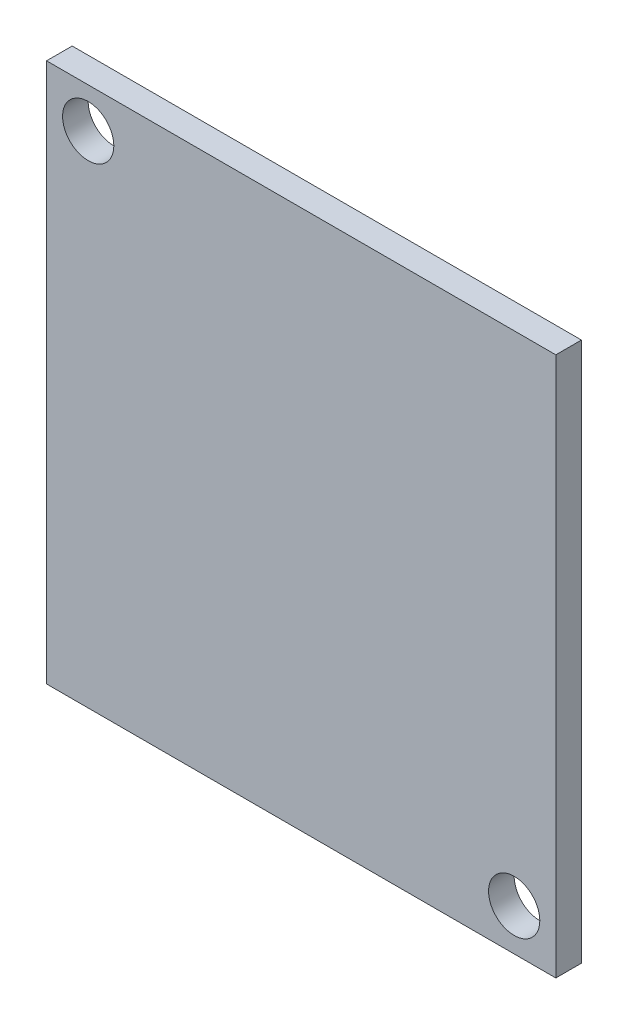
ISO-10303-21;
HEADER;
FILE_DESCRIPTION(('STEP AP214'),'2;1');
FILE_NAME('part.step','',(''),(''),'','','');
FILE_SCHEMA(('AUTOMOTIVE_DESIGN { 1 0 10303 214 1 1 1 1 }'));
ENDSEC;
DATA;
#1=APPLICATION_CONTEXT('core data for automotive mechanical design processes');
#2=APPLICATION_PROTOCOL_DEFINITION('international standard','automotive_design',2000,#1);
#3=PRODUCT_CONTEXT('',#1,'mechanical');
#4=PRODUCT('Part','Part','',(#3));
#5=PRODUCT_RELATED_PRODUCT_CATEGORY('part','',(#4));
#6=PRODUCT_DEFINITION_FORMATION('','',#4);
#7=PRODUCT_DEFINITION_CONTEXT('part definition',#1,'design');
#8=PRODUCT_DEFINITION('design','',#6,#7);
#9=PRODUCT_DEFINITION_SHAPE('','',#8);
#10=(LENGTH_UNIT() NAMED_UNIT(*) SI_UNIT(.MILLI.,.METRE.));
#11=(NAMED_UNIT(*) PLANE_ANGLE_UNIT() SI_UNIT($,.RADIAN.));
#12=(NAMED_UNIT(*) SI_UNIT($,.STERADIAN.) SOLID_ANGLE_UNIT());
#13=UNCERTAINTY_MEASURE_WITH_UNIT(LENGTH_MEASURE(1.E-05),#10,'distance_accuracy_value','');
#14=(GEOMETRIC_REPRESENTATION_CONTEXT(3) GLOBAL_UNCERTAINTY_ASSIGNED_CONTEXT((#13)) GLOBAL_UNIT_ASSIGNED_CONTEXT((#10,
#11,#12)) REPRESENTATION_CONTEXT('',''));
#15=CARTESIAN_POINT('',(0.,0.,0.));
#16=DIRECTION('',(0.,0.,1.));
#17=DIRECTION('',(1.,0.,0.));
#18=AXIS2_PLACEMENT_3D('',#15,#16,#17);
#19=CARTESIAN_POINT('',(0.,0.,0.));
#20=DIRECTION('',(0.,0.,1.));
#21=DIRECTION('',(1.,0.,0.));
#22=AXIS2_PLACEMENT_3D('',#19,#20,#21);
#23=PLANE('',#22);
#24=CARTESIAN_POINT('',(13.3,-14.25,0.));
#25=DIRECTION('',(0.,0.,1.));
#26=DIRECTION('',(1.,0.,0.));
#27=AXIS2_PLACEMENT_3D('',#24,#25,#26);
#28=CIRCLE('',#27,1.6);
#29=CARTESIAN_POINT('',(14.9,-14.25,0.));
#30=VERTEX_POINT('',#29);
#31=EDGE_CURVE('E88',#30,#30,#28,.T.);
#32=ORIENTED_EDGE('',*,*,#31,.T.);
#33=EDGE_LOOP('',(#32));
#34=FACE_BOUND('',#33,.T.);
#35=CARTESIAN_POINT('',(-13.3,14.35,0.));
#36=DIRECTION('',(0.,0.,1.));
#37=DIRECTION('',(1.,0.,0.));
#38=AXIS2_PLACEMENT_3D('',#35,#36,#37);
#39=CIRCLE('',#38,1.6);
#40=CARTESIAN_POINT('',(-11.7,14.35,0.));
#41=VERTEX_POINT('',#40);
#42=EDGE_CURVE('E20',#41,#41,#39,.T.);
#43=ORIENTED_EDGE('',*,*,#42,.T.);
#44=EDGE_LOOP('',(#43));
#45=FACE_BOUND('',#44,.T.);
#46=DIRECTION('',(0.,1.,0.));
#47=VECTOR('',#46,1.);
#48=CARTESIAN_POINT('',(-15.9,-16.85,0.));
#49=LINE('',#48,#47);
#50=CARTESIAN_POINT('',(-15.9,16.85,0.));
#51=VERTEX_POINT('',#50);
#52=CARTESIAN_POINT('',(-15.9,-16.85,0.));
#53=VERTEX_POINT('',#52);
#54=EDGE_CURVE('E64',#51,#53,#49,.F.);
#55=ORIENTED_EDGE('',*,*,#54,.F.);
#56=DIRECTION('',(1.,0.,0.));
#57=VECTOR('',#56,1.);
#58=CARTESIAN_POINT('',(-15.9,16.85,0.));
#59=LINE('',#58,#57);
#60=CARTESIAN_POINT('',(15.9,16.85,0.));
#61=VERTEX_POINT('',#60);
#62=EDGE_CURVE('E99',#61,#51,#59,.F.);
#63=ORIENTED_EDGE('',*,*,#62,.F.);
#64=DIRECTION('',(0.,1.,0.));
#65=VECTOR('',#64,1.);
#66=CARTESIAN_POINT('',(15.9,16.85,0.));
#67=LINE('',#66,#65);
#68=CARTESIAN_POINT('',(15.9,-16.85,0.));
#69=VERTEX_POINT('',#68);
#70=EDGE_CURVE('E74',#69,#61,#67,.T.);
#71=ORIENTED_EDGE('',*,*,#70,.F.);
#72=DIRECTION('',(1.,0.,0.));
#73=VECTOR('',#72,1.);
#74=CARTESIAN_POINT('',(15.9,-16.85,0.));
#75=LINE('',#74,#73);
#76=EDGE_CURVE('E59',#53,#69,#75,.T.);
#77=ORIENTED_EDGE('',*,*,#76,.F.);
#78=EDGE_LOOP('',(#55,#63,#71,#77));
#79=FACE_BOUND('',#78,.T.);
#80=ADVANCED_FACE('F17',(#34,#45,#79),#23,.F.);
#81=CARTESIAN_POINT('',(-15.9,-16.85,0.));
#82=DIRECTION('',(-1.,0.,0.));
#83=DIRECTION('',(0.,0.,1.));
#84=AXIS2_PLACEMENT_3D('',#81,#82,#83);
#85=PLANE('',#84);
#86=ORIENTED_EDGE('',*,*,#54,.T.);
#87=DIRECTION('',(0.,0.,-1.));
#88=VECTOR('',#87,1.);
#89=CARTESIAN_POINT('',(-15.9,-16.85,0.));
#90=LINE('',#89,#88);
#91=CARTESIAN_POINT('',(-15.9,-16.85,1.6));
#92=VERTEX_POINT('',#91);
#93=EDGE_CURVE('E66',#92,#53,#90,.T.);
#94=ORIENTED_EDGE('',*,*,#93,.F.);
#95=DIRECTION('',(0.,1.,0.));
#96=VECTOR('',#95,1.);
#97=CARTESIAN_POINT('',(-15.9,0.,1.6));
#98=LINE('',#97,#96);
#99=CARTESIAN_POINT('',(-15.9,16.85,1.6));
#100=VERTEX_POINT('',#99);
#101=EDGE_CURVE('E91',#100,#92,#98,.F.);
#102=ORIENTED_EDGE('',*,*,#101,.F.);
#103=DIRECTION('',(0.,0.,1.));
#104=VECTOR('',#103,1.);
#105=CARTESIAN_POINT('',(-15.9,16.85,0.));
#106=LINE('',#105,#104);
#107=EDGE_CURVE('E69',#51,#100,#106,.T.);
#108=ORIENTED_EDGE('',*,*,#107,.F.);
#109=EDGE_LOOP('',(#86,#94,#102,#108));
#110=FACE_BOUND('',#109,.T.);
#111=ADVANCED_FACE('F65',(#110),#85,.T.);
#112=CARTESIAN_POINT('',(15.9,-16.85,0.));
#113=DIRECTION('',(0.,-1.,0.));
#114=DIRECTION('',(0.,0.,-1.));
#115=AXIS2_PLACEMENT_3D('',#112,#113,#114);
#116=PLANE('',#115);
#117=ORIENTED_EDGE('',*,*,#76,.T.);
#118=DIRECTION('',(0.,0.,-1.));
#119=VECTOR('',#118,1.);
#120=CARTESIAN_POINT('',(15.9,-16.85,0.));
#121=LINE('',#120,#119);
#122=CARTESIAN_POINT('',(15.9,-16.85,1.6));
#123=VERTEX_POINT('',#122);
#124=EDGE_CURVE('E77',#123,#69,#121,.T.);
#125=ORIENTED_EDGE('',*,*,#124,.F.);
#126=DIRECTION('',(1.,0.,0.));
#127=VECTOR('',#126,1.);
#128=CARTESIAN_POINT('',(0.,-16.85,1.6));
#129=LINE('',#128,#127);
#130=EDGE_CURVE('E81',#92,#123,#129,.T.);
#131=ORIENTED_EDGE('',*,*,#130,.F.);
#132=ORIENTED_EDGE('',*,*,#93,.T.);
#133=EDGE_LOOP('',(#117,#125,#131,#132));
#134=FACE_BOUND('',#133,.T.);
#135=ADVANCED_FACE('F79',(#134),#116,.T.);
#136=CARTESIAN_POINT('',(15.9,16.85,0.));
#137=DIRECTION('',(1.,0.,0.));
#138=DIRECTION('',(0.,0.,-1.));
#139=AXIS2_PLACEMENT_3D('',#136,#137,#138);
#140=PLANE('',#139);
#141=ORIENTED_EDGE('',*,*,#70,.T.);
#142=DIRECTION('',(0.,0.,1.));
#143=VECTOR('',#142,1.);
#144=CARTESIAN_POINT('',(15.9,16.85,0.));
#145=LINE('',#144,#143);
#146=CARTESIAN_POINT('',(15.9,16.85,1.6));
#147=VERTEX_POINT('',#146);
#148=EDGE_CURVE('E39',#147,#61,#145,.F.);
#149=ORIENTED_EDGE('',*,*,#148,.F.);
#150=DIRECTION('',(0.,1.,0.));
#151=VECTOR('',#150,1.);
#152=CARTESIAN_POINT('',(15.9,0.,1.6));
#153=LINE('',#152,#151);
#154=EDGE_CURVE('E112',#123,#147,#153,.T.);
#155=ORIENTED_EDGE('',*,*,#154,.F.);
#156=ORIENTED_EDGE('',*,*,#124,.T.);
#157=EDGE_LOOP('',(#141,#149,#155,#156));
#158=FACE_BOUND('',#157,.T.);
#159=ADVANCED_FACE('F110',(#158),#140,.T.);
#160=CARTESIAN_POINT('',(-15.9,16.85,0.));
#161=DIRECTION('',(0.,1.,0.));
#162=DIRECTION('',(0.,0.,1.));
#163=AXIS2_PLACEMENT_3D('',#160,#161,#162);
#164=PLANE('',#163);
#165=ORIENTED_EDGE('',*,*,#62,.T.);
#166=ORIENTED_EDGE('',*,*,#107,.T.);
#167=DIRECTION('',(1.,0.,0.));
#168=VECTOR('',#167,1.);
#169=CARTESIAN_POINT('',(0.,16.85,1.6));
#170=LINE('',#169,#168);
#171=EDGE_CURVE('E87',#147,#100,#170,.F.);
#172=ORIENTED_EDGE('',*,*,#171,.F.);
#173=ORIENTED_EDGE('',*,*,#148,.T.);
#174=EDGE_LOOP('',(#165,#166,#172,#173));
#175=FACE_BOUND('',#174,.T.);
#176=ADVANCED_FACE('F120',(#175),#164,.T.);
#177=CARTESIAN_POINT('',(-13.3,14.35,-2.4));
#178=DIRECTION('',(0.,0.,1.));
#179=DIRECTION('',(1.,0.,0.));
#180=AXIS2_PLACEMENT_3D('',#177,#178,#179);
#181=CYLINDRICAL_SURFACE('',#180,1.6);
#182=CARTESIAN_POINT('',(-13.3,14.35,1.6));
#183=DIRECTION('',(0.,0.,1.));
#184=DIRECTION('',(1.,0.,0.));
#185=AXIS2_PLACEMENT_3D('',#182,#183,#184);
#186=CIRCLE('',#185,1.6);
#187=CARTESIAN_POINT('',(-11.7,14.35,1.6));
#188=VERTEX_POINT('',#187);
#189=EDGE_CURVE('E27',#188,#188,#186,.F.);
#190=ORIENTED_EDGE('',*,*,#189,.F.);
#191=EDGE_LOOP('',(#190));
#192=FACE_BOUND('',#191,.T.);
#193=ORIENTED_EDGE('',*,*,#42,.F.);
#194=EDGE_LOOP('',(#193));
#195=FACE_BOUND('',#194,.T.);
#196=ADVANCED_FACE('F122',(#192,#195),#181,.F.);
#197=CARTESIAN_POINT('',(13.3,-14.25,-2.4));
#198=DIRECTION('',(0.,0.,1.));
#199=DIRECTION('',(1.,0.,0.));
#200=AXIS2_PLACEMENT_3D('',#197,#198,#199);
#201=CYLINDRICAL_SURFACE('',#200,1.6);
#202=CARTESIAN_POINT('',(13.3,-14.25,1.6));
#203=DIRECTION('',(0.,0.,1.));
#204=DIRECTION('',(1.,0.,0.));
#205=AXIS2_PLACEMENT_3D('',#202,#203,#204);
#206=CIRCLE('',#205,1.6);
#207=CARTESIAN_POINT('',(14.9,-14.25,1.6));
#208=VERTEX_POINT('',#207);
#209=EDGE_CURVE('E11',#208,#208,#206,.F.);
#210=ORIENTED_EDGE('',*,*,#209,.F.);
#211=EDGE_LOOP('',(#210));
#212=FACE_BOUND('',#211,.T.);
#213=ORIENTED_EDGE('',*,*,#31,.F.);
#214=EDGE_LOOP('',(#213));
#215=FACE_BOUND('',#214,.T.);
#216=ADVANCED_FACE('F129',(#212,#215),#201,.F.);
#217=CARTESIAN_POINT('',(0.,0.,1.6));
#218=DIRECTION('',(0.,0.,1.));
#219=DIRECTION('',(1.,0.,0.));
#220=AXIS2_PLACEMENT_3D('',#217,#218,#219);
#221=PLANE('',#220);
#222=ORIENTED_EDGE('',*,*,#209,.T.);
#223=EDGE_LOOP('',(#222));
#224=FACE_BOUND('',#223,.T.);
#225=ORIENTED_EDGE('',*,*,#189,.T.);
#226=EDGE_LOOP('',(#225));
#227=FACE_BOUND('',#226,.T.);
#228=ORIENTED_EDGE('',*,*,#154,.T.);
#229=ORIENTED_EDGE('',*,*,#171,.T.);
#230=ORIENTED_EDGE('',*,*,#101,.T.);
#231=ORIENTED_EDGE('',*,*,#130,.T.);
#232=EDGE_LOOP('',(#228,#229,#230,#231));
#233=FACE_BOUND('',#232,.T.);
#234=ADVANCED_FACE('F116',(#224,#227,#233),#221,.T.);
#235=CLOSED_SHELL('',(#80,#111,#135,#159,#176,#196,#216,#234));
#236=MANIFOLD_SOLID_BREP('B1',#235);
#237=ADVANCED_BREP_SHAPE_REPRESENTATION('',(#18,#236),#14);
#238=SHAPE_DEFINITION_REPRESENTATION(#9,#237);
ENDSEC;
END-ISO-10303-21;
